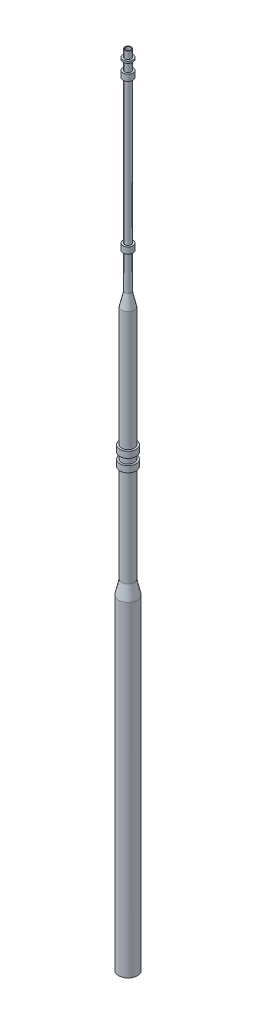
ISO-10303-21;
HEADER;
FILE_DESCRIPTION(('STEP AP214'),'2;1');
FILE_NAME('part.step','',(''),(''),'','','');
FILE_SCHEMA(('AUTOMOTIVE_DESIGN { 1 0 10303 214 1 1 1 1 }'));
ENDSEC;
DATA;
#1=APPLICATION_CONTEXT('core data for automotive mechanical design processes');
#2=APPLICATION_PROTOCOL_DEFINITION('international standard','automotive_design',2000,#1);
#3=PRODUCT_CONTEXT('',#1,'mechanical');
#4=PRODUCT('Part','Part','',(#3));
#5=PRODUCT_RELATED_PRODUCT_CATEGORY('part','',(#4));
#6=PRODUCT_DEFINITION_FORMATION('','',#4);
#7=PRODUCT_DEFINITION_CONTEXT('part definition',#1,'design');
#8=PRODUCT_DEFINITION('design','',#6,#7);
#9=PRODUCT_DEFINITION_SHAPE('','',#8);
#10=(LENGTH_UNIT() NAMED_UNIT(*) SI_UNIT(.MILLI.,.METRE.));
#11=(NAMED_UNIT(*) PLANE_ANGLE_UNIT() SI_UNIT($,.RADIAN.));
#12=(NAMED_UNIT(*) SI_UNIT($,.STERADIAN.) SOLID_ANGLE_UNIT());
#13=UNCERTAINTY_MEASURE_WITH_UNIT(LENGTH_MEASURE(1.E-05),#10,'distance_accuracy_value','');
#14=(GEOMETRIC_REPRESENTATION_CONTEXT(3) GLOBAL_UNCERTAINTY_ASSIGNED_CONTEXT((#13)) GLOBAL_UNIT_ASSIGNED_CONTEXT((#10,
#11,#12)) REPRESENTATION_CONTEXT('',''));
#15=CARTESIAN_POINT('',(0.,0.,0.));
#16=DIRECTION('',(0.,0.,1.));
#17=DIRECTION('',(1.,0.,0.));
#18=AXIS2_PLACEMENT_3D('',#15,#16,#17);
#19=CARTESIAN_POINT('',(0.,1280.,0.));
#20=DIRECTION('',(0.,-1.,0.));
#21=DIRECTION('',(0.,0.,-1.));
#22=AXIS2_PLACEMENT_3D('',#19,#20,#21);
#23=CYLINDRICAL_SURFACE('',#22,5.);
#24=CARTESIAN_POINT('',(0.,1250.,0.));
#25=DIRECTION('',(0.,1.,0.));
#26=DIRECTION('',(0.,0.,1.));
#27=AXIS2_PLACEMENT_3D('',#24,#25,#26);
#28=CIRCLE('',#27,5.);
#29=CARTESIAN_POINT('',(0.,1250.,5.));
#30=VERTEX_POINT('',#29);
#31=EDGE_CURVE('E60',#30,#30,#28,.T.);
#32=ORIENTED_EDGE('',*,*,#31,.T.);
#33=EDGE_LOOP('',(#32));
#34=FACE_BOUND('',#33,.T.);
#35=CARTESIAN_POINT('',(0.,1265.,0.));
#36=DIRECTION('',(0.,1.,0.));
#37=DIRECTION('',(0.,0.,1.));
#38=AXIS2_PLACEMENT_3D('',#35,#36,#37);
#39=CIRCLE('',#38,5.);
#40=CARTESIAN_POINT('',(0.,1265.,5.));
#41=VERTEX_POINT('',#40);
#42=EDGE_CURVE('E11',#41,#41,#39,.T.);
#43=ORIENTED_EDGE('',*,*,#42,.F.);
#44=EDGE_LOOP('',(#43));
#45=FACE_BOUND('',#44,.T.);
#46=ADVANCED_FACE('F37',(#34,#45),#23,.T.);
#47=CARTESIAN_POINT('',(0.,900.,0.));
#48=DIRECTION('',(0.,-1.,0.));
#49=DIRECTION('',(0.,0.,-1.));
#50=AXIS2_PLACEMENT_3D('',#47,#48,#49);
#51=CYLINDRICAL_SURFACE('',#50,10.);
#52=CARTESIAN_POINT('',(0.,710.,0.));
#53=DIRECTION('',(0.,1.,0.));
#54=DIRECTION('',(0.,0.,1.));
#55=AXIS2_PLACEMENT_3D('',#52,#53,#54);
#56=CIRCLE('',#55,10.);
#57=CARTESIAN_POINT('',(0.,710.,10.));
#58=VERTEX_POINT('',#57);
#59=EDGE_CURVE('E68',#58,#58,#56,.T.);
#60=ORIENTED_EDGE('',*,*,#59,.T.);
#61=EDGE_LOOP('',(#60));
#62=FACE_BOUND('',#61,.T.);
#63=CARTESIAN_POINT('',(0.,720.,0.));
#64=DIRECTION('',(0.,1.,0.));
#65=DIRECTION('',(0.,0.,1.));
#66=AXIS2_PLACEMENT_3D('',#63,#64,#65);
#67=CIRCLE('',#66,10.);
#68=CARTESIAN_POINT('',(0.,720.,10.));
#69=VERTEX_POINT('',#68);
#70=EDGE_CURVE('E45',#69,#69,#67,.T.);
#71=ORIENTED_EDGE('',*,*,#70,.F.);
#72=EDGE_LOOP('',(#71));
#73=FACE_BOUND('',#72,.T.);
#74=ADVANCED_FACE('F153',(#62,#73),#51,.T.);
#75=CARTESIAN_POINT('',(0.,943.314758742843,0.));
#76=DIRECTION('',(0.,1.,0.));
#77=DIRECTION('',(0.,0.,1.));
#78=AXIS2_PLACEMENT_3D('',#75,#76,#77);
#79=CIRCLE('',#78,5.);
#80=CARTESIAN_POINT('',(0.,943.314758742843,-5.00000000000001));
#81=VERTEX_POINT('',#80);
#82=EDGE_CURVE('E85',#81,#81,#79,.T.);
#83=ORIENTED_EDGE('',*,*,#82,.T.);
#84=EDGE_LOOP('',(#83));
#85=FACE_BOUND('',#84,.T.);
#86=CARTESIAN_POINT('',(0.,1000.,0.));
#87=DIRECTION('',(0.,1.,0.));
#88=DIRECTION('',(0.,0.,1.));
#89=AXIS2_PLACEMENT_3D('',#86,#87,#88);
#90=CIRCLE('',#89,5.);
#91=CARTESIAN_POINT('',(0.,1000.,5.));
#92=VERTEX_POINT('',#91);
#93=EDGE_CURVE('E49',#92,#92,#90,.T.);
#94=ORIENTED_EDGE('',*,*,#93,.F.);
#95=EDGE_LOOP('',(#94));
#96=FACE_BOUND('',#95,.T.);
#97=ADVANCED_FACE('F156',(#85,#96),#23,.T.);
#98=CARTESIAN_POINT('',(0.,1010.,0.));
#99=DIRECTION('',(0.,1.,0.));
#100=DIRECTION('',(0.,0.,1.));
#101=AXIS2_PLACEMENT_3D('',#98,#99,#100);
#102=CIRCLE('',#101,5.);
#103=CARTESIAN_POINT('',(0.,1010.,5.));
#104=VERTEX_POINT('',#103);
#105=EDGE_CURVE('E52',#104,#104,#102,.T.);
#106=ORIENTED_EDGE('',*,*,#105,.T.);
#107=EDGE_LOOP('',(#106));
#108=FACE_BOUND('',#107,.T.);
#109=CARTESIAN_POINT('',(0.,1240.,0.));
#110=DIRECTION('',(0.,1.,0.));
#111=DIRECTION('',(0.,0.,1.));
#112=AXIS2_PLACEMENT_3D('',#109,#110,#111);
#113=CIRCLE('',#112,5.);
#114=CARTESIAN_POINT('',(0.,1240.,5.));
#115=VERTEX_POINT('',#114);
#116=EDGE_CURVE('E59',#115,#115,#113,.T.);
#117=ORIENTED_EDGE('',*,*,#116,.F.);
#118=EDGE_LOOP('',(#117));
#119=FACE_BOUND('',#118,.T.);
#120=ADVANCED_FACE('F169',(#108,#119),#23,.T.);
#121=CARTESIAN_POINT('',(0.,543.314758742843,0.));
#122=DIRECTION('',(0.,1.,0.));
#123=DIRECTION('',(0.,0.,1.));
#124=AXIS2_PLACEMENT_3D('',#121,#122,#123);
#125=CIRCLE('',#124,10.);
#126=CARTESIAN_POINT('',(0.,543.314758742843,-10.));
#127=VERTEX_POINT('',#126);
#128=EDGE_CURVE('E88',#127,#127,#125,.T.);
#129=ORIENTED_EDGE('',*,*,#128,.T.);
#130=EDGE_LOOP('',(#129));
#131=FACE_BOUND('',#130,.T.);
#132=CARTESIAN_POINT('',(0.,700.,0.));
#133=DIRECTION('',(0.,1.,0.));
#134=DIRECTION('',(0.,0.,1.));
#135=AXIS2_PLACEMENT_3D('',#132,#133,#134);
#136=CIRCLE('',#135,10.);
#137=CARTESIAN_POINT('',(0.,700.,10.));
#138=VERTEX_POINT('',#137);
#139=EDGE_CURVE('E67',#138,#138,#136,.T.);
#140=ORIENTED_EDGE('',*,*,#139,.F.);
#141=EDGE_LOOP('',(#140));
#142=FACE_BOUND('',#141,.T.);
#143=ADVANCED_FACE('F164',(#131,#142),#51,.T.);
#144=CARTESIAN_POINT('',(0.,500.,0.));
#145=DIRECTION('',(0.,-1.,0.));
#146=DIRECTION('',(0.,0.,-1.));
#147=AXIS2_PLACEMENT_3D('',#144,#145,#146);
#148=CYLINDRICAL_SURFACE('',#147,15.);
#149=CARTESIAN_POINT('',(0.,521.657379371422,0.));
#150=DIRECTION('',(0.,-1.,0.));
#151=DIRECTION('',(0.,0.,-1.));
#152=AXIS2_PLACEMENT_3D('',#149,#150,#151);
#153=CIRCLE('',#152,15.);
#154=CARTESIAN_POINT('',(0.,521.657379371422,-15.));
#155=VERTEX_POINT('',#154);
#156=EDGE_CURVE('E82',#155,#155,#153,.T.);
#157=ORIENTED_EDGE('',*,*,#156,.T.);
#158=EDGE_LOOP('',(#157));
#159=FACE_BOUND('',#158,.T.);
#160=CARTESIAN_POINT('',(0.,0.,0.));
#161=DIRECTION('',(0.,1.,0.));
#162=DIRECTION('',(0.,0.,1.));
#163=AXIS2_PLACEMENT_3D('',#160,#161,#162);
#164=CIRCLE('',#163,15.);
#165=CARTESIAN_POINT('',(0.,0.,15.));
#166=VERTEX_POINT('',#165);
#167=EDGE_CURVE('E79',#166,#166,#164,.T.);
#168=ORIENTED_EDGE('',*,*,#167,.T.);
#169=EDGE_LOOP('',(#168));
#170=FACE_BOUND('',#169,.T.);
#171=ADVANCED_FACE('F186',(#159,#170),#148,.T.);
#172=CARTESIAN_POINT('',(0.,0.,0.));
#173=DIRECTION('',(0.,1.,0.));
#174=DIRECTION('',(0.,0.,1.));
#175=AXIS2_PLACEMENT_3D('',#172,#173,#174);
#176=PLANE('',#175);
#177=CARTESIAN_POINT('',(0.,0.,0.));
#178=DIRECTION('',(0.,1.,0.));
#179=DIRECTION('',(0.,0.,1.));
#180=AXIS2_PLACEMENT_3D('',#177,#178,#179);
#181=CIRCLE('',#180,4.);
#182=CARTESIAN_POINT('',(0.,0.,4.));
#183=VERTEX_POINT('',#182);
#184=EDGE_CURVE('E71',#183,#183,#181,.T.);
#185=ORIENTED_EDGE('',*,*,#184,.T.);
#186=EDGE_LOOP('',(#185));
#187=FACE_BOUND('',#186,.T.);
#188=ORIENTED_EDGE('',*,*,#167,.F.);
#189=EDGE_LOOP('',(#188));
#190=FACE_BOUND('',#189,.T.);
#191=ADVANCED_FACE('F230',(#187,#190),#176,.F.);
#192=CARTESIAN_POINT('',(0.,730.,0.));
#193=DIRECTION('',(0.,1.,0.));
#194=DIRECTION('',(0.,0.,1.));
#195=AXIS2_PLACEMENT_3D('',#192,#193,#194);
#196=CIRCLE('',#195,10.);
#197=CARTESIAN_POINT('',(0.,730.,10.));
#198=VERTEX_POINT('',#197);
#199=EDGE_CURVE('E117',#198,#198,#196,.T.);
#200=ORIENTED_EDGE('',*,*,#199,.T.);
#201=EDGE_LOOP('',(#200));
#202=FACE_BOUND('',#201,.T.);
#203=CARTESIAN_POINT('',(0.,921.657379371422,0.));
#204=DIRECTION('',(0.,-1.,0.));
#205=DIRECTION('',(0.,0.,-1.));
#206=AXIS2_PLACEMENT_3D('',#203,#204,#205);
#207=CIRCLE('',#206,10.);
#208=CARTESIAN_POINT('',(0.,921.657379371422,-9.99999999999999));
#209=VERTEX_POINT('',#208);
#210=EDGE_CURVE('E75',#209,#209,#207,.T.);
#211=ORIENTED_EDGE('',*,*,#210,.T.);
#212=EDGE_LOOP('',(#211));
#213=FACE_BOUND('',#212,.T.);
#214=ADVANCED_FACE('F165',(#202,#213),#51,.T.);
#215=CARTESIAN_POINT('',(0.,1280.,0.));
#216=DIRECTION('',(0.,1.,0.));
#217=DIRECTION('',(0.,0.,1.));
#218=AXIS2_PLACEMENT_3D('',#215,#216,#217);
#219=PLANE('',#218);
#220=CARTESIAN_POINT('',(0.,1280.,0.));
#221=DIRECTION('',(0.,1.,0.));
#222=DIRECTION('',(0.,0.,1.));
#223=AXIS2_PLACEMENT_3D('',#220,#221,#222);
#224=CIRCLE('',#223,4.);
#225=CARTESIAN_POINT('',(0.,1280.,4.));
#226=VERTEX_POINT('',#225);
#227=EDGE_CURVE('E76',#226,#226,#224,.T.);
#228=ORIENTED_EDGE('',*,*,#227,.F.);
#229=EDGE_LOOP('',(#228));
#230=FACE_BOUND('',#229,.T.);
#231=CARTESIAN_POINT('',(0.,1280.,0.));
#232=DIRECTION('',(0.,1.,0.));
#233=DIRECTION('',(0.,0.,1.));
#234=AXIS2_PLACEMENT_3D('',#231,#232,#233);
#235=CIRCLE('',#234,5.);
#236=CARTESIAN_POINT('',(0.,1280.,5.));
#237=VERTEX_POINT('',#236);
#238=EDGE_CURVE('E91',#237,#237,#235,.T.);
#239=ORIENTED_EDGE('',*,*,#238,.T.);
#240=EDGE_LOOP('',(#239));
#241=FACE_BOUND('',#240,.T.);
#242=ADVANCED_FACE('F172',(#230,#241),#219,.T.);
#243=CARTESIAN_POINT('',(0.,1268.,0.));
#244=DIRECTION('',(0.,1.,0.));
#245=DIRECTION('',(0.,0.,1.));
#246=AXIS2_PLACEMENT_3D('',#243,#244,#245);
#247=CIRCLE('',#246,5.);
#248=CARTESIAN_POINT('',(0.,1268.,5.));
#249=VERTEX_POINT('',#248);
#250=EDGE_CURVE('E41',#249,#249,#247,.T.);
#251=ORIENTED_EDGE('',*,*,#250,.T.);
#252=EDGE_LOOP('',(#251));
#253=FACE_BOUND('',#252,.T.);
#254=ORIENTED_EDGE('',*,*,#238,.F.);
#255=EDGE_LOOP('',(#254));
#256=FACE_BOUND('',#255,.T.);
#257=ADVANCED_FACE('F130',(#253,#256),#23,.T.);
#258=CARTESIAN_POINT('',(0.,543.314758742843,0.));
#259=DIRECTION('',(0.,-1.,0.));
#260=DIRECTION('',(0.,0.,-1.));
#261=AXIS2_PLACEMENT_3D('',#258,#259,#260);
#262=CONICAL_SURFACE('',#261,10.,0.226892802759261);
#263=CARTESIAN_POINT('',(0.,521.657379371422,-15.));
#264=CARTESIAN_POINT('',(0.,521.882977073208,-14.9479166666666));
#265=CARTESIAN_POINT('',(0.,522.108574774994,-14.8958333333333));
#266=CARTESIAN_POINT('',(0.,522.559770178565,-14.7916666666667));
#267=CARTESIAN_POINT('',(0.,522.785367880351,-14.7395833333333));
#268=CARTESIAN_POINT('',(0.,523.236563283922,-14.6354166666667));
#269=CARTESIAN_POINT('',(0.,523.462160985707,-14.5833333333333));
#270=CARTESIAN_POINT('',(0.,523.913356389279,-14.4791666666667));
#271=CARTESIAN_POINT('',(0.,524.138954091064,-14.4270833333333));
#272=CARTESIAN_POINT('',(0.,524.590149494636,-14.3229166666667));
#273=CARTESIAN_POINT('',(0.,524.815747196421,-14.2708333333333));
#274=CARTESIAN_POINT('',(0.,525.266942599992,-14.1666666666667));
#275=CARTESIAN_POINT('',(0.,525.492540301778,-14.1145833333333));
#276=CARTESIAN_POINT('',(0.,525.943735705349,-14.0104166666667));
#277=CARTESIAN_POINT('',(0.,526.169333407135,-13.9583333333333));
#278=CARTESIAN_POINT('',(0.,526.620528810706,-13.8541666666667));
#279=CARTESIAN_POINT('',(0.,526.846126512492,-13.8020833333333));
#280=CARTESIAN_POINT('',(0.,527.297321916063,-13.6979166666667));
#281=CARTESIAN_POINT('',(0.,527.522919617849,-13.6458333333333));
#282=CARTESIAN_POINT('',(0.,527.97411502142,-13.5416666666667));
#283=CARTESIAN_POINT('',(0.,528.199712723206,-13.4895833333333));
#284=CARTESIAN_POINT('',(0.,528.650908126777,-13.3854166666667));
#285=CARTESIAN_POINT('',(0.,528.876505828563,-13.3333333333333));
#286=CARTESIAN_POINT('',(0.,529.327701232134,-13.2291666666667));
#287=CARTESIAN_POINT('',(0.,529.55329893392,-13.1770833333333));
#288=CARTESIAN_POINT('',(0.,530.004494337491,-13.0729166666667));
#289=CARTESIAN_POINT('',(0.,530.230092039276,-13.0208333333333));
#290=CARTESIAN_POINT('',(0.,530.681287442848,-12.9166666666667));
#291=CARTESIAN_POINT('',(0.,530.906885144633,-12.8645833333333));
#292=CARTESIAN_POINT('',(0.,531.358080548205,-12.7604166666667));
#293=CARTESIAN_POINT('',(0.,531.58367824999,-12.7083333333333));
#294=CARTESIAN_POINT('',(0.,532.034873653561,-12.6041666666667));
#295=CARTESIAN_POINT('',(0.,532.260471355347,-12.5520833333333));
#296=CARTESIAN_POINT('',(0.,532.711666758918,-12.4479166666667));
#297=CARTESIAN_POINT('',(0.,532.937264460704,-12.3958333333333));
#298=CARTESIAN_POINT('',(0.,533.388459864275,-12.2916666666667));
#299=CARTESIAN_POINT('',(0.,533.614057566061,-12.2395833333333));
#300=CARTESIAN_POINT('',(0.,534.065252969632,-12.1354166666667));
#301=CARTESIAN_POINT('',(0.,534.290850671418,-12.0833333333333));
#302=CARTESIAN_POINT('',(0.,534.742046074989,-11.9791666666667));
#303=CARTESIAN_POINT('',(0.,534.967643776775,-11.9270833333333));
#304=CARTESIAN_POINT('',(0.,535.418839180346,-11.8229166666667));
#305=CARTESIAN_POINT('',(0.,535.644436882132,-11.7708333333333));
#306=CARTESIAN_POINT('',(0.,536.095632285703,-11.6666666666667));
#307=CARTESIAN_POINT('',(0.,536.321229987489,-11.6145833333333));
#308=CARTESIAN_POINT('',(0.,536.77242539106,-11.5104166666667));
#309=CARTESIAN_POINT('',(0.,536.998023092846,-11.4583333333333));
#310=CARTESIAN_POINT('',(0.,537.449218496417,-11.3541666666667));
#311=CARTESIAN_POINT('',(0.,537.674816198202,-11.3020833333333));
#312=CARTESIAN_POINT('',(0.,538.126011601774,-11.1979166666667));
#313=CARTESIAN_POINT('',(0.,538.351609303559,-11.1458333333333));
#314=CARTESIAN_POINT('',(0.,538.802804707131,-11.0416666666667));
#315=CARTESIAN_POINT('',(0.,539.028402408916,-10.9895833333333));
#316=CARTESIAN_POINT('',(0.,539.479597812487,-10.8854166666667));
#317=CARTESIAN_POINT('',(0.,539.705195514273,-10.8333333333333));
#318=CARTESIAN_POINT('',(0.,540.156390917844,-10.7291666666667));
#319=CARTESIAN_POINT('',(0.,540.38198861963,-10.6770833333333));
#320=CARTESIAN_POINT('',(0.,540.833184023201,-10.5729166666667));
#321=CARTESIAN_POINT('',(0.,541.058781724987,-10.5208333333333));
#322=CARTESIAN_POINT('',(0.,541.509977128558,-10.4166666666667));
#323=CARTESIAN_POINT('',(0.,541.735574830344,-10.3645833333333));
#324=CARTESIAN_POINT('',(0.,542.186770233915,-10.2604166666667));
#325=CARTESIAN_POINT('',(0.,542.412367935701,-10.2083333333333));
#326=CARTESIAN_POINT('',(0.,542.863563339272,-10.1041666666667));
#327=CARTESIAN_POINT('',(0.,543.089161041058,-10.0520833333334));
#328=CARTESIAN_POINT('',(0.,543.314758742843,-10.));
#329=B_SPLINE_CURVE_WITH_KNOTS('',3,(#263,#264,#265,#266,#267,#268,#269,#270,#271,#272,#273,
#274,#275,#276,#277,#278,#279,#280,#281,#282,#283,#284,#285,#286,#287,#288,#289,#290,#291,#292,
#293,#294,#295,#296,#297,#298,#299,#300,#301,#302,#303,#304,#305,#306,#307,#308,#309,#310,#311,
#312,#313,#314,#315,#316,#317,#318,#319,#320,#321,#322,#323,#324,#325,#326,#327,#328),
.UNSPECIFIED.,.F.,.F.,(4,2,2,2,2,2,2,2,2,2,2,2,2,2,2,2,2,2,2,2,2,2,2,2,2,2,2,2,2,2,2,2,4),(0.,
0.694595544153976,1.38919108830806,2.08378663246204,2.77838217661612,3.4729777207701,
4.16757326492418,4.86216880907816,5.55676435323225,6.25135989738622,6.94595544154031,
7.64055098569428,8.33514652984837,9.02974207400234,9.72433761815643,10.4189331623104,
11.1135287064645,11.8081242506186,12.5027197947726,13.1973153389266,13.8919108830806,
14.5865064272347,15.2811019713887,15.9756975155428,16.6702930596967,17.3648886038508,
18.0594841480048,18.7540796921589,19.4486752363129,20.1432707804669,20.8378663246209,
21.532461868775,22.2270574129291),.UNSPECIFIED.);
#330=EDGE_CURVE('BSEAM171',#155,#127,#329,.T.);
#331=ORIENTED_EDGE('',*,*,#156,.F.);
#332=ORIENTED_EDGE('',*,*,#128,.F.);
#333=ORIENTED_EDGE('',*,*,#330,.T.);
#334=ORIENTED_EDGE('',*,*,#330,.F.);
#335=EDGE_LOOP('',(#331,#333,#332,#334));
#336=FACE_BOUND('',#335,.T.);
#337=ADVANCED_FACE('F171',(#336),#262,.T.);
#338=CARTESIAN_POINT('',(0.,943.314758742843,0.));
#339=DIRECTION('',(0.,-1.,0.));
#340=DIRECTION('',(0.,0.,-1.));
#341=AXIS2_PLACEMENT_3D('',#338,#339,#340);
#342=CONICAL_SURFACE('',#341,5.,0.226892802759261);
#343=CARTESIAN_POINT('',(0.,921.657379371422,-9.99999999999999));
#344=CARTESIAN_POINT('',(0.,921.882977073208,-9.94791666666665));
#345=CARTESIAN_POINT('',(0.,922.108574774994,-9.89583333333332));
#346=CARTESIAN_POINT('',(0.,922.559770178565,-9.79166666666666));
#347=CARTESIAN_POINT('',(0.,922.785367880351,-9.73958333333333));
#348=CARTESIAN_POINT('',(0.,923.236563283922,-9.63541666666666));
#349=CARTESIAN_POINT('',(0.,923.462160985707,-9.58333333333332));
#350=CARTESIAN_POINT('',(0.,923.913356389279,-9.47916666666666));
#351=CARTESIAN_POINT('',(0.,924.138954091064,-9.42708333333333));
#352=CARTESIAN_POINT('',(0.,924.590149494636,-9.32291666666666));
#353=CARTESIAN_POINT('',(0.,924.815747196421,-9.27083333333332));
#354=CARTESIAN_POINT('',(0.,925.266942599992,-9.16666666666666));
#355=CARTESIAN_POINT('',(0.,925.492540301778,-9.11458333333333));
#356=CARTESIAN_POINT('',(0.,925.943735705349,-9.01041666666666));
#357=CARTESIAN_POINT('',(0.,926.169333407135,-8.95833333333332));
#358=CARTESIAN_POINT('',(0.,926.620528810706,-8.85416666666665));
#359=CARTESIAN_POINT('',(0.,926.846126512492,-8.80208333333333));
#360=CARTESIAN_POINT('',(0.,927.297321916063,-8.69791666666666));
#361=CARTESIAN_POINT('',(0.,927.522919617849,-8.64583333333333));
#362=CARTESIAN_POINT('',(0.,927.97411502142,-8.54166666666666));
#363=CARTESIAN_POINT('',(0.,928.199712723206,-8.48958333333333));
#364=CARTESIAN_POINT('',(0.,928.650908126777,-8.38541666666667));
#365=CARTESIAN_POINT('',(0.,928.876505828563,-8.33333333333333));
#366=CARTESIAN_POINT('',(0.,929.327701232134,-8.22916666666666));
#367=CARTESIAN_POINT('',(0.,929.55329893392,-8.17708333333334));
#368=CARTESIAN_POINT('',(0.,930.004494337491,-8.07291666666667));
#369=CARTESIAN_POINT('',(0.,930.230092039276,-8.02083333333333));
#370=CARTESIAN_POINT('',(0.,930.681287442848,-7.91666666666666));
#371=CARTESIAN_POINT('',(0.,930.906885144633,-7.86458333333334));
#372=CARTESIAN_POINT('',(0.,931.358080548205,-7.76041666666667));
#373=CARTESIAN_POINT('',(0.,931.58367824999,-7.70833333333333));
#374=CARTESIAN_POINT('',(0.,932.034873653561,-7.60416666666666));
#375=CARTESIAN_POINT('',(0.,932.260471355347,-7.55208333333333));
#376=CARTESIAN_POINT('',(0.,932.711666758918,-7.44791666666667));
#377=CARTESIAN_POINT('',(0.,932.937264460704,-7.39583333333334));
#378=CARTESIAN_POINT('',(0.,933.388459864275,-7.29166666666667));
#379=CARTESIAN_POINT('',(0.,933.614057566061,-7.23958333333333));
#380=CARTESIAN_POINT('',(0.,934.065252969632,-7.13541666666667));
#381=CARTESIAN_POINT('',(0.,934.290850671418,-7.08333333333334));
#382=CARTESIAN_POINT('',(0.,934.742046074989,-6.97916666666667));
#383=CARTESIAN_POINT('',(0.,934.967643776775,-6.92708333333333));
#384=CARTESIAN_POINT('',(0.,935.418839180346,-6.82291666666667));
#385=CARTESIAN_POINT('',(0.,935.644436882132,-6.77083333333334));
#386=CARTESIAN_POINT('',(0.,936.095632285703,-6.66666666666667));
#387=CARTESIAN_POINT('',(0.,936.321229987489,-6.61458333333333));
#388=CARTESIAN_POINT('',(0.,936.77242539106,-6.51041666666667));
#389=CARTESIAN_POINT('',(0.,936.998023092846,-6.45833333333334));
#390=CARTESIAN_POINT('',(0.,937.449218496417,-6.35416666666668));
#391=CARTESIAN_POINT('',(0.,937.674816198202,-6.30208333333334));
#392=CARTESIAN_POINT('',(0.,938.126011601774,-6.19791666666667));
#393=CARTESIAN_POINT('',(0.,938.351609303559,-6.14583333333335));
#394=CARTESIAN_POINT('',(0.,938.802804707131,-6.04166666666668));
#395=CARTESIAN_POINT('',(0.,939.028402408916,-5.98958333333334));
#396=CARTESIAN_POINT('',(0.,939.479597812487,-5.88541666666667));
#397=CARTESIAN_POINT('',(0.,939.705195514273,-5.83333333333335));
#398=CARTESIAN_POINT('',(0.,940.156390917844,-5.72916666666668));
#399=CARTESIAN_POINT('',(0.,940.38198861963,-5.67708333333334));
#400=CARTESIAN_POINT('',(0.,940.833184023201,-5.57291666666667));
#401=CARTESIAN_POINT('',(0.,941.058781724987,-5.52083333333335));
#402=CARTESIAN_POINT('',(0.,941.509977128558,-5.41666666666668));
#403=CARTESIAN_POINT('',(0.,941.735574830344,-5.36458333333334));
#404=CARTESIAN_POINT('',(0.,942.186770233915,-5.26041666666667));
#405=CARTESIAN_POINT('',(0.,942.412367935701,-5.20833333333334));
#406=CARTESIAN_POINT('',(0.,942.863563339272,-5.10416666666668));
#407=CARTESIAN_POINT('',(0.,943.089161041058,-5.05208333333335));
#408=CARTESIAN_POINT('',(0.,943.314758742843,-5.00000000000001));
#409=B_SPLINE_CURVE_WITH_KNOTS('',3,(#343,#344,#345,#346,#347,#348,#349,#350,#351,#352,#353,
#354,#355,#356,#357,#358,#359,#360,#361,#362,#363,#364,#365,#366,#367,#368,#369,#370,#371,#372,
#373,#374,#375,#376,#377,#378,#379,#380,#381,#382,#383,#384,#385,#386,#387,#388,#389,#390,#391,
#392,#393,#394,#395,#396,#397,#398,#399,#400,#401,#402,#403,#404,#405,#406,#407,#408),
.UNSPECIFIED.,.F.,.F.,(4,2,2,2,2,2,2,2,2,2,2,2,2,2,2,2,2,2,2,2,2,2,2,2,2,2,2,2,2,2,2,2,4),(0.,
0.694595544154085,1.38919108830817,2.08378663246215,2.77838217661623,3.47297772077021,
4.16757326492429,4.86216880907827,5.55676435323235,6.25135989738633,6.94595544154041,
7.64055098569439,8.33514652984848,9.02974207400245,9.72433761815654,10.4189331623105,
11.1135287064646,11.8081242506187,12.5027197947727,13.1973153389267,13.8919108830807,
14.5865064272348,15.2811019713888,15.9756975155429,16.6702930596968,17.3648886038509,
18.0594841480049,18.754079692159,19.448675236313,20.1432707804671,20.837866324621,
21.5324618687751,22.2270574129292),.UNSPECIFIED.);
#410=EDGE_CURVE('BSEAM39',#209,#81,#409,.T.);
#411=ORIENTED_EDGE('',*,*,#210,.F.);
#412=ORIENTED_EDGE('',*,*,#82,.F.);
#413=ORIENTED_EDGE('',*,*,#410,.T.);
#414=ORIENTED_EDGE('',*,*,#410,.F.);
#415=EDGE_LOOP('',(#411,#413,#412,#414));
#416=FACE_BOUND('',#415,.T.);
#417=ADVANCED_FACE('F39',(#416),#342,.T.);
#418=CARTESIAN_POINT('',(0.,0.,0.));
#419=DIRECTION('',(0.,1.,0.));
#420=DIRECTION('',(0.,0.,1.));
#421=AXIS2_PLACEMENT_3D('',#418,#419,#420);
#422=CYLINDRICAL_SURFACE('',#421,4.);
#423=ORIENTED_EDGE('',*,*,#227,.T.);
#424=EDGE_LOOP('',(#423));
#425=FACE_BOUND('',#424,.T.);
#426=ORIENTED_EDGE('',*,*,#184,.F.);
#427=EDGE_LOOP('',(#426));
#428=FACE_BOUND('',#427,.T.);
#429=ADVANCED_FACE('F217',(#425,#428),#422,.F.);
#430=CARTESIAN_POINT('',(0.,710.,0.));
#431=DIRECTION('',(0.,1.,0.));
#432=DIRECTION('',(0.,0.,1.));
#433=AXIS2_PLACEMENT_3D('',#430,#431,#432);
#434=PLANE('',#433);
#435=ORIENTED_EDGE('',*,*,#59,.F.);
#436=EDGE_LOOP('',(#435));
#437=FACE_BOUND('',#436,.T.);
#438=CARTESIAN_POINT('',(0.,710.,0.));
#439=DIRECTION('',(0.,1.,0.));
#440=DIRECTION('',(0.,0.,1.));
#441=AXIS2_PLACEMENT_3D('',#438,#439,#440);
#442=CIRCLE('',#441,13.);
#443=CARTESIAN_POINT('',(0.,710.,13.));
#444=VERTEX_POINT('',#443);
#445=EDGE_CURVE('E72',#444,#444,#442,.T.);
#446=ORIENTED_EDGE('',*,*,#445,.T.);
#447=EDGE_LOOP('',(#446));
#448=FACE_BOUND('',#447,.T.);
#449=ADVANCED_FACE('F213',(#437,#448),#434,.T.);
#450=CARTESIAN_POINT('',(0.,700.,0.));
#451=DIRECTION('',(0.,1.,0.));
#452=DIRECTION('',(0.,0.,1.));
#453=AXIS2_PLACEMENT_3D('',#450,#451,#452);
#454=PLANE('',#453);
#455=ORIENTED_EDGE('',*,*,#139,.T.);
#456=EDGE_LOOP('',(#455));
#457=FACE_BOUND('',#456,.T.);
#458=CARTESIAN_POINT('',(0.,700.,0.));
#459=DIRECTION('',(0.,1.,0.));
#460=DIRECTION('',(0.,0.,1.));
#461=AXIS2_PLACEMENT_3D('',#458,#459,#460);
#462=CIRCLE('',#461,13.);
#463=CARTESIAN_POINT('',(0.,700.,13.));
#464=VERTEX_POINT('',#463);
#465=EDGE_CURVE('E63',#464,#464,#462,.T.);
#466=ORIENTED_EDGE('',*,*,#465,.F.);
#467=EDGE_LOOP('',(#466));
#468=FACE_BOUND('',#467,.T.);
#469=ADVANCED_FACE('F216',(#457,#468),#454,.F.);
#470=CARTESIAN_POINT('',(0.,710.,0.));
#471=DIRECTION('',(0.,-1.,0.));
#472=DIRECTION('',(0.,0.,-1.));
#473=AXIS2_PLACEMENT_3D('',#470,#471,#472);
#474=CYLINDRICAL_SURFACE('',#473,13.);
#475=ORIENTED_EDGE('',*,*,#445,.F.);
#476=EDGE_LOOP('',(#475));
#477=FACE_BOUND('',#476,.T.);
#478=ORIENTED_EDGE('',*,*,#465,.T.);
#479=EDGE_LOOP('',(#478));
#480=FACE_BOUND('',#479,.T.);
#481=ADVANCED_FACE('F221',(#477,#480),#474,.T.);
#482=CARTESIAN_POINT('',(0.,1250.,0.));
#483=DIRECTION('',(0.,1.,0.));
#484=DIRECTION('',(0.,0.,1.));
#485=AXIS2_PLACEMENT_3D('',#482,#483,#484);
#486=PLANE('',#485);
#487=ORIENTED_EDGE('',*,*,#31,.F.);
#488=EDGE_LOOP('',(#487));
#489=FACE_BOUND('',#488,.T.);
#490=CARTESIAN_POINT('',(0.,1250.,0.));
#491=DIRECTION('',(0.,1.,0.));
#492=DIRECTION('',(0.,0.,1.));
#493=AXIS2_PLACEMENT_3D('',#490,#491,#492);
#494=CIRCLE('',#493,8.);
#495=CARTESIAN_POINT('',(0.,1250.,8.));
#496=VERTEX_POINT('',#495);
#497=EDGE_CURVE('E64',#496,#496,#494,.T.);
#498=ORIENTED_EDGE('',*,*,#497,.T.);
#499=EDGE_LOOP('',(#498));
#500=FACE_BOUND('',#499,.T.);
#501=ADVANCED_FACE('F196',(#489,#500),#486,.T.);
#502=CARTESIAN_POINT('',(0.,1240.,0.));
#503=DIRECTION('',(0.,1.,0.));
#504=DIRECTION('',(0.,0.,1.));
#505=AXIS2_PLACEMENT_3D('',#502,#503,#504);
#506=PLANE('',#505);
#507=ORIENTED_EDGE('',*,*,#116,.T.);
#508=EDGE_LOOP('',(#507));
#509=FACE_BOUND('',#508,.T.);
#510=CARTESIAN_POINT('',(0.,1240.,0.));
#511=DIRECTION('',(0.,1.,0.));
#512=DIRECTION('',(0.,0.,1.));
#513=AXIS2_PLACEMENT_3D('',#510,#511,#512);
#514=CIRCLE('',#513,8.);
#515=CARTESIAN_POINT('',(0.,1240.,8.));
#516=VERTEX_POINT('',#515);
#517=EDGE_CURVE('E55',#516,#516,#514,.T.);
#518=ORIENTED_EDGE('',*,*,#517,.F.);
#519=EDGE_LOOP('',(#518));
#520=FACE_BOUND('',#519,.T.);
#521=ADVANCED_FACE('F192',(#509,#520),#506,.F.);
#522=CARTESIAN_POINT('',(0.,1250.,0.));
#523=DIRECTION('',(0.,-1.,0.));
#524=DIRECTION('',(0.,0.,-1.));
#525=AXIS2_PLACEMENT_3D('',#522,#523,#524);
#526=CYLINDRICAL_SURFACE('',#525,8.);
#527=ORIENTED_EDGE('',*,*,#497,.F.);
#528=EDGE_LOOP('',(#527));
#529=FACE_BOUND('',#528,.T.);
#530=ORIENTED_EDGE('',*,*,#517,.T.);
#531=EDGE_LOOP('',(#530));
#532=FACE_BOUND('',#531,.T.);
#533=ADVANCED_FACE('F195',(#529,#532),#526,.T.);
#534=CARTESIAN_POINT('',(0.,1010.,0.));
#535=DIRECTION('',(0.,1.,0.));
#536=DIRECTION('',(0.,0.,1.));
#537=AXIS2_PLACEMENT_3D('',#534,#535,#536);
#538=PLANE('',#537);
#539=ORIENTED_EDGE('',*,*,#105,.F.);
#540=EDGE_LOOP('',(#539));
#541=FACE_BOUND('',#540,.T.);
#542=CARTESIAN_POINT('',(0.,1010.,0.));
#543=DIRECTION('',(0.,1.,0.));
#544=DIRECTION('',(0.,0.,1.));
#545=AXIS2_PLACEMENT_3D('',#542,#543,#544);
#546=CIRCLE('',#545,8.);
#547=CARTESIAN_POINT('',(0.,1010.,8.));
#548=VERTEX_POINT('',#547);
#549=EDGE_CURVE('E56',#548,#548,#546,.T.);
#550=ORIENTED_EDGE('',*,*,#549,.T.);
#551=EDGE_LOOP('',(#550));
#552=FACE_BOUND('',#551,.T.);
#553=ADVANCED_FACE('F201',(#541,#552),#538,.T.);
#554=CARTESIAN_POINT('',(0.,1000.,0.));
#555=DIRECTION('',(0.,1.,0.));
#556=DIRECTION('',(0.,0.,1.));
#557=AXIS2_PLACEMENT_3D('',#554,#555,#556);
#558=PLANE('',#557);
#559=ORIENTED_EDGE('',*,*,#93,.T.);
#560=EDGE_LOOP('',(#559));
#561=FACE_BOUND('',#560,.T.);
#562=CARTESIAN_POINT('',(0.,1000.,0.));
#563=DIRECTION('',(0.,1.,0.));
#564=DIRECTION('',(0.,0.,1.));
#565=AXIS2_PLACEMENT_3D('',#562,#563,#564);
#566=CIRCLE('',#565,8.);
#567=CARTESIAN_POINT('',(0.,1000.,8.));
#568=VERTEX_POINT('',#567);
#569=EDGE_CURVE('E106',#568,#568,#566,.T.);
#570=ORIENTED_EDGE('',*,*,#569,.F.);
#571=EDGE_LOOP('',(#570));
#572=FACE_BOUND('',#571,.T.);
#573=ADVANCED_FACE('F207',(#561,#572),#558,.F.);
#574=CARTESIAN_POINT('',(0.,1010.,0.));
#575=DIRECTION('',(0.,-1.,0.));
#576=DIRECTION('',(0.,0.,-1.));
#577=AXIS2_PLACEMENT_3D('',#574,#575,#576);
#578=CYLINDRICAL_SURFACE('',#577,8.);
#579=ORIENTED_EDGE('',*,*,#549,.F.);
#580=EDGE_LOOP('',(#579));
#581=FACE_BOUND('',#580,.T.);
#582=ORIENTED_EDGE('',*,*,#569,.T.);
#583=EDGE_LOOP('',(#582));
#584=FACE_BOUND('',#583,.T.);
#585=ADVANCED_FACE('F148',(#581,#584),#578,.T.);
#586=CARTESIAN_POINT('',(0.,720.,0.));
#587=DIRECTION('',(0.,1.,0.));
#588=DIRECTION('',(0.,0.,1.));
#589=AXIS2_PLACEMENT_3D('',#586,#587,#588);
#590=PLANE('',#589);
#591=ORIENTED_EDGE('',*,*,#70,.T.);
#592=EDGE_LOOP('',(#591));
#593=FACE_BOUND('',#592,.T.);
#594=CARTESIAN_POINT('',(0.,720.,0.));
#595=DIRECTION('',(0.,1.,0.));
#596=DIRECTION('',(0.,0.,1.));
#597=AXIS2_PLACEMENT_3D('',#594,#595,#596);
#598=CIRCLE('',#597,13.);
#599=CARTESIAN_POINT('',(0.,720.,13.));
#600=VERTEX_POINT('',#599);
#601=EDGE_CURVE('E114',#600,#600,#598,.T.);
#602=ORIENTED_EDGE('',*,*,#601,.F.);
#603=EDGE_LOOP('',(#602));
#604=FACE_BOUND('',#603,.T.);
#605=ADVANCED_FACE('F138',(#593,#604),#590,.F.);
#606=CARTESIAN_POINT('',(0.,730.,0.));
#607=DIRECTION('',(0.,1.,0.));
#608=DIRECTION('',(0.,0.,1.));
#609=AXIS2_PLACEMENT_3D('',#606,#607,#608);
#610=PLANE('',#609);
#611=ORIENTED_EDGE('',*,*,#199,.F.);
#612=EDGE_LOOP('',(#611));
#613=FACE_BOUND('',#612,.T.);
#614=CARTESIAN_POINT('',(0.,730.,0.));
#615=DIRECTION('',(0.,1.,0.));
#616=DIRECTION('',(0.,0.,1.));
#617=AXIS2_PLACEMENT_3D('',#614,#615,#616);
#618=CIRCLE('',#617,13.);
#619=CARTESIAN_POINT('',(0.,730.,13.));
#620=VERTEX_POINT('',#619);
#621=EDGE_CURVE('E109',#620,#620,#618,.T.);
#622=ORIENTED_EDGE('',*,*,#621,.T.);
#623=EDGE_LOOP('',(#622));
#624=FACE_BOUND('',#623,.T.);
#625=ADVANCED_FACE('F145',(#613,#624),#610,.T.);
#626=CARTESIAN_POINT('',(0.,720.,0.));
#627=DIRECTION('',(0.,1.,0.));
#628=DIRECTION('',(0.,0.,1.));
#629=AXIS2_PLACEMENT_3D('',#626,#627,#628);
#630=CYLINDRICAL_SURFACE('',#629,13.);
#631=CARTESIAN_POINT('',(0.,720.,13.));
#632=CARTESIAN_POINT('',(0.,720.104166666667,13.));
#633=CARTESIAN_POINT('',(0.,720.208333333333,13.));
#634=CARTESIAN_POINT('',(0.,720.416666666667,13.));
#635=CARTESIAN_POINT('',(0.,720.520833333333,13.));
#636=CARTESIAN_POINT('',(0.,720.729166666667,13.));
#637=CARTESIAN_POINT('',(0.,720.833333333333,13.));
#638=CARTESIAN_POINT('',(0.,721.041666666667,13.));
#639=CARTESIAN_POINT('',(0.,721.145833333333,13.));
#640=CARTESIAN_POINT('',(0.,721.354166666667,13.));
#641=CARTESIAN_POINT('',(0.,721.458333333333,13.));
#642=CARTESIAN_POINT('',(0.,721.666666666667,13.));
#643=CARTESIAN_POINT('',(0.,721.770833333333,13.));
#644=CARTESIAN_POINT('',(0.,721.979166666667,13.));
#645=CARTESIAN_POINT('',(0.,722.083333333333,13.));
#646=CARTESIAN_POINT('',(0.,722.291666666667,13.));
#647=CARTESIAN_POINT('',(0.,722.395833333333,13.));
#648=CARTESIAN_POINT('',(0.,722.604166666667,13.));
#649=CARTESIAN_POINT('',(0.,722.708333333333,13.));
#650=CARTESIAN_POINT('',(0.,722.916666666667,13.));
#651=CARTESIAN_POINT('',(0.,723.020833333333,13.));
#652=CARTESIAN_POINT('',(0.,723.229166666667,13.));
#653=CARTESIAN_POINT('',(0.,723.333333333333,13.));
#654=CARTESIAN_POINT('',(0.,723.541666666667,13.));
#655=CARTESIAN_POINT('',(0.,723.645833333333,13.));
#656=CARTESIAN_POINT('',(0.,723.854166666667,13.));
#657=CARTESIAN_POINT('',(0.,723.958333333333,13.));
#658=CARTESIAN_POINT('',(0.,724.166666666667,13.));
#659=CARTESIAN_POINT('',(0.,724.270833333333,13.));
#660=CARTESIAN_POINT('',(0.,724.479166666667,13.));
#661=CARTESIAN_POINT('',(0.,724.583333333333,13.));
#662=CARTESIAN_POINT('',(0.,724.791666666667,13.));
#663=CARTESIAN_POINT('',(0.,724.895833333333,13.));
#664=CARTESIAN_POINT('',(0.,725.104166666667,13.));
#665=CARTESIAN_POINT('',(0.,725.208333333333,13.));
#666=CARTESIAN_POINT('',(0.,725.416666666667,13.));
#667=CARTESIAN_POINT('',(0.,725.520833333333,13.));
#668=CARTESIAN_POINT('',(0.,725.729166666667,13.));
#669=CARTESIAN_POINT('',(0.,725.833333333333,13.));
#670=CARTESIAN_POINT('',(0.,726.041666666667,13.));
#671=CARTESIAN_POINT('',(0.,726.145833333333,13.));
#672=CARTESIAN_POINT('',(0.,726.354166666667,13.));
#673=CARTESIAN_POINT('',(0.,726.458333333333,13.));
#674=CARTESIAN_POINT('',(0.,726.666666666667,13.));
#675=CARTESIAN_POINT('',(0.,726.770833333333,13.));
#676=CARTESIAN_POINT('',(0.,726.979166666667,13.));
#677=CARTESIAN_POINT('',(0.,727.083333333333,13.));
#678=CARTESIAN_POINT('',(0.,727.291666666667,13.));
#679=CARTESIAN_POINT('',(0.,727.395833333333,13.));
#680=CARTESIAN_POINT('',(0.,727.604166666667,13.));
#681=CARTESIAN_POINT('',(0.,727.708333333333,13.));
#682=CARTESIAN_POINT('',(0.,727.916666666667,13.));
#683=CARTESIAN_POINT('',(0.,728.020833333333,13.));
#684=CARTESIAN_POINT('',(0.,728.229166666667,13.));
#685=CARTESIAN_POINT('',(0.,728.333333333333,13.));
#686=CARTESIAN_POINT('',(0.,728.541666666667,13.));
#687=CARTESIAN_POINT('',(0.,728.645833333333,13.));
#688=CARTESIAN_POINT('',(0.,728.854166666667,13.));
#689=CARTESIAN_POINT('',(0.,728.958333333333,13.));
#690=CARTESIAN_POINT('',(0.,729.166666666667,13.));
#691=CARTESIAN_POINT('',(0.,729.270833333333,13.));
#692=CARTESIAN_POINT('',(0.,729.479166666667,13.));
#693=CARTESIAN_POINT('',(0.,729.583333333333,13.));
#694=CARTESIAN_POINT('',(0.,729.791666666667,13.));
#695=CARTESIAN_POINT('',(0.,729.895833333333,13.));
#696=CARTESIAN_POINT('',(0.,730.,13.));
#697=B_SPLINE_CURVE_WITH_KNOTS('',3,(#631,#632,#633,#634,#635,#636,#637,#638,#639,#640,#641,
#642,#643,#644,#645,#646,#647,#648,#649,#650,#651,#652,#653,#654,#655,#656,#657,#658,#659,#660,
#661,#662,#663,#664,#665,#666,#667,#668,#669,#670,#671,#672,#673,#674,#675,#676,#677,#678,#679,
#680,#681,#682,#683,#684,#685,#686,#687,#688,#689,#690,#691,#692,#693,#694,#695,#696),
.UNSPECIFIED.,.F.,.F.,(4,2,2,2,2,2,2,2,2,2,2,2,2,2,2,2,2,2,2,2,2,2,2,2,2,2,2,2,2,2,2,2,4),(0.,
0.312500000000049,0.625000000000098,0.937500000000036,1.25000000000008,1.56250000000002,
1.87500000000007,2.18750000000001,2.50000000000006,2.81250000000011,3.12500000000004,
3.43750000000009,3.75000000000003,4.06250000000008,4.37500000000002,4.68750000000007,5.,
5.31250000000005,5.6250000000001,5.93750000000004,6.25000000000009,6.56250000000003,
6.87500000000008,7.18750000000001,7.50000000000006,7.81250000000011,8.12500000000005,
8.4375000000001,8.75000000000004,9.06250000000009,9.37500000000002,9.68750000000007,
10.0000000000001),.UNSPECIFIED.);
#698=EDGE_CURVE('BSEAM136',#600,#620,#697,.T.);
#699=ORIENTED_EDGE('',*,*,#601,.T.);
#700=ORIENTED_EDGE('',*,*,#621,.F.);
#701=ORIENTED_EDGE('',*,*,#698,.T.);
#702=ORIENTED_EDGE('',*,*,#698,.F.);
#703=EDGE_LOOP('',(#699,#701,#700,#702));
#704=FACE_BOUND('',#703,.T.);
#705=ADVANCED_FACE('F136',(#704),#630,.T.);
#706=CARTESIAN_POINT('',(0.,1268.,0.));
#707=DIRECTION('',(0.,1.,0.));
#708=DIRECTION('',(0.,0.,1.));
#709=AXIS2_PLACEMENT_3D('',#706,#707,#708);
#710=PLANE('',#709);
#711=ORIENTED_EDGE('',*,*,#250,.F.);
#712=EDGE_LOOP('',(#711));
#713=FACE_BOUND('',#712,.T.);
#714=CARTESIAN_POINT('',(0.,1268.,0.));
#715=DIRECTION('',(0.,1.,0.));
#716=DIRECTION('',(0.,0.,1.));
#717=AXIS2_PLACEMENT_3D('',#714,#715,#716);
#718=CIRCLE('',#717,8.);
#719=CARTESIAN_POINT('',(0.,1268.,8.));
#720=VERTEX_POINT('',#719);
#721=EDGE_CURVE('E123',#720,#720,#718,.T.);
#722=ORIENTED_EDGE('',*,*,#721,.T.);
#723=EDGE_LOOP('',(#722));
#724=FACE_BOUND('',#723,.T.);
#725=ADVANCED_FACE('F133',(#713,#724),#710,.T.);
#726=CARTESIAN_POINT('',(0.,1265.,0.));
#727=DIRECTION('',(0.,1.,0.));
#728=DIRECTION('',(0.,0.,1.));
#729=AXIS2_PLACEMENT_3D('',#726,#727,#728);
#730=PLANE('',#729);
#731=ORIENTED_EDGE('',*,*,#42,.T.);
#732=EDGE_LOOP('',(#731));
#733=FACE_BOUND('',#732,.T.);
#734=CARTESIAN_POINT('',(0.,1265.,0.));
#735=DIRECTION('',(0.,1.,0.));
#736=DIRECTION('',(0.,0.,1.));
#737=AXIS2_PLACEMENT_3D('',#734,#735,#736);
#738=CIRCLE('',#737,8.);
#739=CARTESIAN_POINT('',(0.,1265.,8.));
#740=VERTEX_POINT('',#739);
#741=EDGE_CURVE('E120',#740,#740,#738,.T.);
#742=ORIENTED_EDGE('',*,*,#741,.F.);
#743=EDGE_LOOP('',(#742));
#744=FACE_BOUND('',#743,.T.);
#745=ADVANCED_FACE('F135',(#733,#744),#730,.F.);
#746=CARTESIAN_POINT('',(0.,1268.,0.));
#747=DIRECTION('',(0.,-1.,0.));
#748=DIRECTION('',(0.,0.,-1.));
#749=AXIS2_PLACEMENT_3D('',#746,#747,#748);
#750=CYLINDRICAL_SURFACE('',#749,8.);
#751=ORIENTED_EDGE('',*,*,#721,.F.);
#752=EDGE_LOOP('',(#751));
#753=FACE_BOUND('',#752,.T.);
#754=ORIENTED_EDGE('',*,*,#741,.T.);
#755=EDGE_LOOP('',(#754));
#756=FACE_BOUND('',#755,.T.);
#757=ADVANCED_FACE('F143',(#753,#756),#750,.T.);
#758=CLOSED_SHELL('',(#46,#74,#97,#120,#143,#171,#191,#214,#242,#257,#337,#417,#429,#449,#469,
#481,#501,#521,#533,#553,#573,#585,#605,#625,#705,#725,#745,#757));
#759=MANIFOLD_SOLID_BREP('B2',#758);
#760=ADVANCED_BREP_SHAPE_REPRESENTATION('',(#18,#759),#14);
#761=SHAPE_DEFINITION_REPRESENTATION(#9,#760);
ENDSEC;
END-ISO-10303-21;
